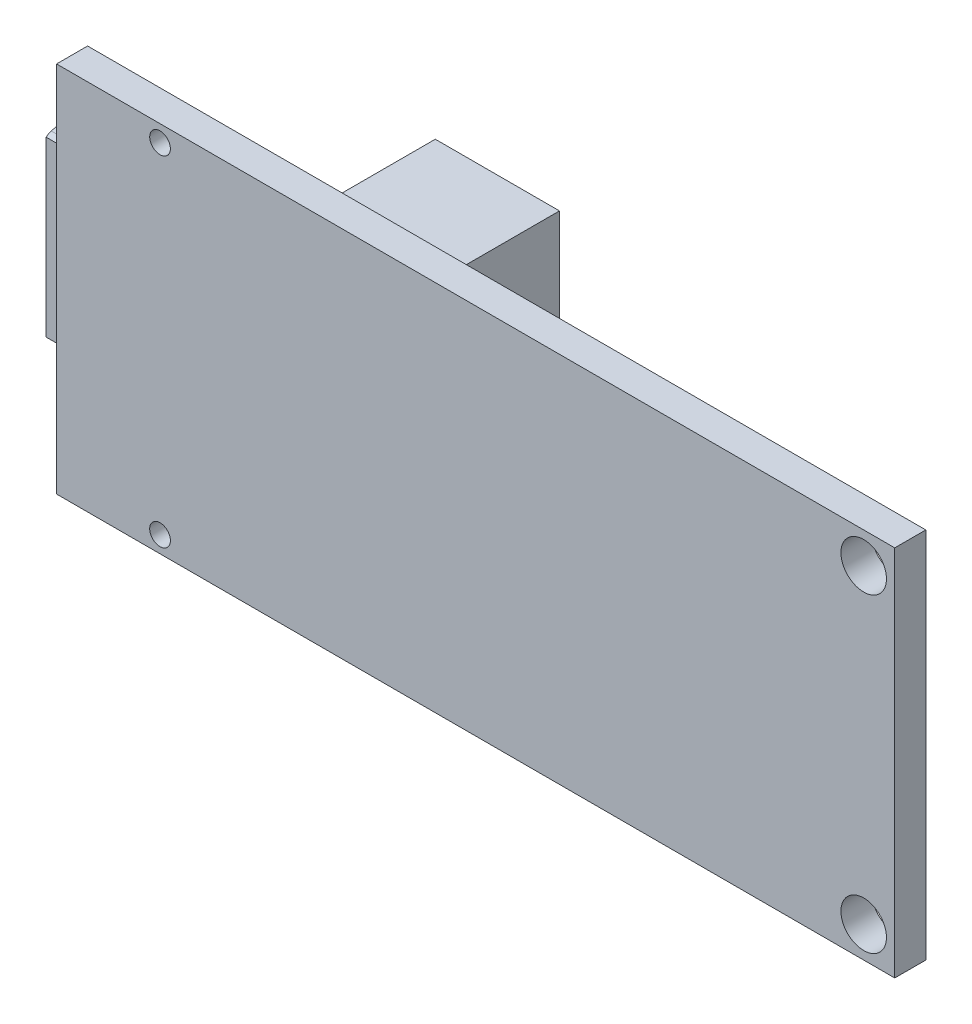
ISO-10303-21;
HEADER;
FILE_DESCRIPTION(('STEP AP214'),'2;1');
FILE_NAME('part.step','',(''),(''),'','','');
FILE_SCHEMA(('AUTOMOTIVE_DESIGN { 1 0 10303 214 1 1 1 1 }'));
ENDSEC;
DATA;
#1=APPLICATION_CONTEXT('core data for automotive mechanical design processes');
#2=APPLICATION_PROTOCOL_DEFINITION('international standard','automotive_design',2000,#1);
#3=PRODUCT_CONTEXT('',#1,'mechanical');
#4=PRODUCT('Part','Part','',(#3));
#5=PRODUCT_RELATED_PRODUCT_CATEGORY('part','',(#4));
#6=PRODUCT_DEFINITION_FORMATION('','',#4);
#7=PRODUCT_DEFINITION_CONTEXT('part definition',#1,'design');
#8=PRODUCT_DEFINITION('design','',#6,#7);
#9=PRODUCT_DEFINITION_SHAPE('','',#8);
#10=(LENGTH_UNIT() NAMED_UNIT(*) SI_UNIT(.MILLI.,.METRE.));
#11=(NAMED_UNIT(*) PLANE_ANGLE_UNIT() SI_UNIT($,.RADIAN.));
#12=(NAMED_UNIT(*) SI_UNIT($,.STERADIAN.) SOLID_ANGLE_UNIT());
#13=UNCERTAINTY_MEASURE_WITH_UNIT(LENGTH_MEASURE(1.E-05),#10,'distance_accuracy_value','');
#14=(GEOMETRIC_REPRESENTATION_CONTEXT(3) GLOBAL_UNCERTAINTY_ASSIGNED_CONTEXT((#13)) GLOBAL_UNIT_ASSIGNED_CONTEXT((#10,
#11,#12)) REPRESENTATION_CONTEXT('',''));
#15=CARTESIAN_POINT('',(0.,0.,0.));
#16=DIRECTION('',(0.,0.,1.));
#17=DIRECTION('',(1.,0.,0.));
#18=AXIS2_PLACEMENT_3D('',#15,#16,#17);
#19=CARTESIAN_POINT('',(0.,0.,0.));
#20=DIRECTION('',(0.,0.,-1.));
#21=DIRECTION('',(-1.,0.,0.));
#22=AXIS2_PLACEMENT_3D('',#19,#20,#21);
#23=PLANE('',#22);
#24=CARTESIAN_POINT('',(-15.25,8.2,0.));
#25=DIRECTION('',(0.,0.,-1.));
#26=DIRECTION('',(-1.,0.,0.));
#27=AXIS2_PLACEMENT_3D('',#24,#25,#26);
#28=CIRCLE('',#27,0.499999999999999);
#29=CARTESIAN_POINT('',(-15.75,8.2,0.));
#30=VERTEX_POINT('',#29);
#31=EDGE_CURVE('E291',#30,#30,#28,.T.);
#32=ORIENTED_EDGE('',*,*,#31,.F.);
#33=EDGE_LOOP('',(#32));
#34=FACE_BOUND('',#33,.T.);
#35=CARTESIAN_POINT('',(-15.25,-8.2,0.));
#36=DIRECTION('',(0.,0.,-1.));
#37=DIRECTION('',(1.,0.,0.));
#38=AXIS2_PLACEMENT_3D('',#35,#36,#37);
#39=CIRCLE('',#38,0.499999999999999);
#40=CARTESIAN_POINT('',(-14.75,-8.2,0.));
#41=VERTEX_POINT('',#40);
#42=EDGE_CURVE('E290',#41,#41,#39,.T.);
#43=ORIENTED_EDGE('',*,*,#42,.F.);
#44=EDGE_LOOP('',(#43));
#45=FACE_BOUND('',#44,.T.);
#46=CARTESIAN_POINT('',(18.75,7.5,0.));
#47=DIRECTION('',(0.,0.,-1.));
#48=DIRECTION('',(-1.,0.,0.));
#49=AXIS2_PLACEMENT_3D('',#46,#47,#48);
#50=CIRCLE('',#49,1.1);
#51=CARTESIAN_POINT('',(17.65,7.5,0.));
#52=VERTEX_POINT('',#51);
#53=EDGE_CURVE('E431',#52,#52,#50,.T.);
#54=ORIENTED_EDGE('',*,*,#53,.F.);
#55=EDGE_LOOP('',(#54));
#56=FACE_BOUND('',#55,.T.);
#57=CARTESIAN_POINT('',(18.75,-7.5,0.));
#58=DIRECTION('',(0.,0.,-1.));
#59=DIRECTION('',(1.,0.,0.));
#60=AXIS2_PLACEMENT_3D('',#57,#58,#59);
#61=CIRCLE('',#60,1.1);
#62=CARTESIAN_POINT('',(19.85,-7.5,0.));
#63=VERTEX_POINT('',#62);
#64=EDGE_CURVE('E435',#63,#63,#61,.T.);
#65=ORIENTED_EDGE('',*,*,#64,.F.);
#66=EDGE_LOOP('',(#65));
#67=FACE_BOUND('',#66,.T.);
#68=DIRECTION('',(1.,0.,0.));
#69=VECTOR('',#68,1.);
#70=CARTESIAN_POINT('',(-2.25000000000001,8.7,0.));
#71=LINE('',#70,#69);
#72=CARTESIAN_POINT('',(-8.25000000000001,8.7,0.));
#73=VERTEX_POINT('',#72);
#74=CARTESIAN_POINT('',(-2.25000000000001,8.7,0.));
#75=VERTEX_POINT('',#74);
#76=EDGE_CURVE('E405',#73,#75,#71,.T.);
#77=ORIENTED_EDGE('',*,*,#76,.F.);
#78=DIRECTION('',(0.,1.,0.));
#79=VECTOR('',#78,1.);
#80=CARTESIAN_POINT('',(-8.25000000000001,8.7,0.));
#81=LINE('',#80,#79);
#82=CARTESIAN_POINT('',(-8.25000000000001,2.7,0.));
#83=VERTEX_POINT('',#82);
#84=EDGE_CURVE('E383',#83,#73,#81,.T.);
#85=ORIENTED_EDGE('',*,*,#84,.F.);
#86=DIRECTION('',(-1.,0.,0.));
#87=VECTOR('',#86,1.);
#88=CARTESIAN_POINT('',(-2.25000000000001,2.7,0.));
#89=LINE('',#88,#87);
#90=CARTESIAN_POINT('',(-2.25000000000001,2.7,0.));
#91=VERTEX_POINT('',#90);
#92=EDGE_CURVE('E392',#91,#83,#89,.T.);
#93=ORIENTED_EDGE('',*,*,#92,.F.);
#94=DIRECTION('',(0.,-1.,0.));
#95=VECTOR('',#94,1.);
#96=CARTESIAN_POINT('',(-2.25000000000001,8.7,0.));
#97=LINE('',#96,#95);
#98=EDGE_CURVE('E408',#75,#91,#97,.T.);
#99=ORIENTED_EDGE('',*,*,#98,.F.);
#100=EDGE_LOOP('',(#77,#85,#93,#99));
#101=FACE_BOUND('',#100,.T.);
#102=DIRECTION('',(0.,-1.,0.));
#103=VECTOR('',#102,1.);
#104=CARTESIAN_POINT('',(-20.25,-9.,0.));
#105=LINE('',#104,#103);
#106=CARTESIAN_POINT('',(-20.25,-4.18410728804132,0.));
#107=VERTEX_POINT('',#106);
#108=CARTESIAN_POINT('',(-20.25,-9.,0.));
#109=VERTEX_POINT('',#108);
#110=EDGE_CURVE('E463',#107,#109,#105,.T.);
#111=ORIENTED_EDGE('',*,*,#110,.F.);
#112=DIRECTION('',(-1.,0.,0.));
#113=VECTOR('',#112,1.);
#114=CARTESIAN_POINT('',(-12.25,-4.18410728804132,0.));
#115=LINE('',#114,#113);
#116=CARTESIAN_POINT('',(-12.25,-4.18410728804132,0.));
#117=VERTEX_POINT('',#116);
#118=EDGE_CURVE('E219',#117,#107,#115,.T.);
#119=ORIENTED_EDGE('',*,*,#118,.F.);
#120=DIRECTION('',(0.,-1.,0.));
#121=VECTOR('',#120,1.);
#122=CARTESIAN_POINT('',(-12.25,-4.5,0.));
#123=LINE('',#122,#121);
#124=CARTESIAN_POINT('',(-12.25,4.18410728804132,0.));
#125=VERTEX_POINT('',#124);
#126=EDGE_CURVE('E367',#125,#117,#123,.T.);
#127=ORIENTED_EDGE('',*,*,#126,.F.);
#128=DIRECTION('',(-1.,0.,0.));
#129=VECTOR('',#128,1.);
#130=CARTESIAN_POINT('',(-12.25,4.18410728804132,0.));
#131=LINE('',#130,#129);
#132=CARTESIAN_POINT('',(-20.25,4.18410728804132,0.));
#133=VERTEX_POINT('',#132);
#134=EDGE_CURVE('E344',#125,#133,#131,.T.);
#135=ORIENTED_EDGE('',*,*,#134,.T.);
#136=CARTESIAN_POINT('',(-20.25,9.,0.));
#137=VERTEX_POINT('',#136);
#138=EDGE_CURVE('E464',#137,#133,#105,.T.);
#139=ORIENTED_EDGE('',*,*,#138,.F.);
#140=DIRECTION('',(-1.,0.,0.));
#141=VECTOR('',#140,1.);
#142=CARTESIAN_POINT('',(-20.25,9.,0.));
#143=LINE('',#142,#141);
#144=CARTESIAN_POINT('',(20.25,9.,0.));
#145=VERTEX_POINT('',#144);
#146=EDGE_CURVE('E460',#145,#137,#143,.T.);
#147=ORIENTED_EDGE('',*,*,#146,.F.);
#148=DIRECTION('',(0.,1.,0.));
#149=VECTOR('',#148,1.);
#150=CARTESIAN_POINT('',(20.25,-9.,0.));
#151=LINE('',#150,#149);
#152=CARTESIAN_POINT('',(20.25,-9.,0.));
#153=VERTEX_POINT('',#152);
#154=EDGE_CURVE('E430',#153,#145,#151,.T.);
#155=ORIENTED_EDGE('',*,*,#154,.F.);
#156=DIRECTION('',(1.,0.,0.));
#157=VECTOR('',#156,1.);
#158=CARTESIAN_POINT('',(-20.25,-9.,0.));
#159=LINE('',#158,#157);
#160=EDGE_CURVE('E447',#109,#153,#159,.T.);
#161=ORIENTED_EDGE('',*,*,#160,.F.);
#162=EDGE_LOOP('',(#111,#119,#127,#135,#139,#147,#155,#161));
#163=FACE_BOUND('',#162,.T.);
#164=ADVANCED_FACE('F49',(#34,#45,#56,#67,#101,#163),#23,.T.);
#165=CARTESIAN_POINT('',(-12.25,-4.5,-3.));
#166=DIRECTION('',(-1.,0.,0.));
#167=DIRECTION('',(0.,0.,1.));
#168=AXIS2_PLACEMENT_3D('',#165,#166,#167);
#169=PLANE('',#168);
#170=CARTESIAN_POINT('',(-12.25,-3.84235950746112,-0.36497733418461));
#171=DIRECTION('',(-1.,0.,0.));
#172=DIRECTION('',(0.,0.,1.));
#173=AXIS2_PLACEMENT_3D('',#170,#171,#172);
#174=CIRCLE('',#173,0.5);
#175=CARTESIAN_POINT('',(-12.25,-4.32632827093174,-0.239381808847451));
#176=VERTEX_POINT('',#175);
#177=EDGE_CURVE('E220',#176,#117,#174,.T.);
#178=ORIENTED_EDGE('',*,*,#177,.F.);
#179=CARTESIAN_POINT('',(-12.25,0.916666666666665,-1.6));
#180=DIRECTION('',(-1.,0.,0.));
#181=DIRECTION('',(0.,0.,1.));
#182=AXIS2_PLACEMENT_3D('',#179,#180,#181);
#183=CIRCLE('',#182,5.41666666666667);
#184=CARTESIAN_POINT('',(-12.25,-4.32632827093174,-2.96061819115255));
#185=VERTEX_POINT('',#184);
#186=EDGE_CURVE('E215',#176,#185,#183,.F.);
#187=ORIENTED_EDGE('',*,*,#186,.T.);
#188=CARTESIAN_POINT('',(-12.25,-3.84235950746112,-2.83502266581539));
#189=DIRECTION('',(-1.,0.,0.));
#190=DIRECTION('',(0.,0.,1.));
#191=AXIS2_PLACEMENT_3D('',#188,#189,#190);
#192=CIRCLE('',#191,0.5);
#193=CARTESIAN_POINT('',(-12.25,-4.31435789644708,-3.));
#194=VERTEX_POINT('',#193);
#195=EDGE_CURVE('E358',#185,#194,#192,.F.);
#196=ORIENTED_EDGE('',*,*,#195,.T.);
#197=DIRECTION('',(0.,-1.,0.));
#198=VECTOR('',#197,1.);
#199=CARTESIAN_POINT('',(-12.25,-4.5,-3.));
#200=LINE('',#199,#198);
#201=CARTESIAN_POINT('',(-12.25,4.31435789644708,-3.));
#202=VERTEX_POINT('',#201);
#203=EDGE_CURVE('E379',#202,#194,#200,.T.);
#204=ORIENTED_EDGE('',*,*,#203,.F.);
#205=CARTESIAN_POINT('',(-12.25,3.84235950746112,-2.83502266581539));
#206=DIRECTION('',(-1.,0.,0.));
#207=DIRECTION('',(0.,0.,1.));
#208=AXIS2_PLACEMENT_3D('',#205,#206,#207);
#209=CIRCLE('',#208,0.500000000000001);
#210=CARTESIAN_POINT('',(-12.25,4.32632827093174,-2.96061819115255));
#211=VERTEX_POINT('',#210);
#212=EDGE_CURVE('E67',#211,#202,#209,.T.);
#213=ORIENTED_EDGE('',*,*,#212,.F.);
#214=CARTESIAN_POINT('',(-12.25,-0.916666666666665,-1.6));
#215=DIRECTION('',(-1.,0.,0.));
#216=DIRECTION('',(0.,0.,1.));
#217=AXIS2_PLACEMENT_3D('',#214,#215,#216);
#218=CIRCLE('',#217,5.41666666666667);
#219=CARTESIAN_POINT('',(-12.25,4.32632827093174,-0.239381808847453));
#220=VERTEX_POINT('',#219);
#221=EDGE_CURVE('E346',#220,#211,#218,.T.);
#222=ORIENTED_EDGE('',*,*,#221,.F.);
#223=CARTESIAN_POINT('',(-12.25,3.84235950746112,-0.364977334184611));
#224=DIRECTION('',(-1.,0.,0.));
#225=DIRECTION('',(0.,0.,1.));
#226=AXIS2_PLACEMENT_3D('',#223,#224,#225);
#227=CIRCLE('',#226,0.5);
#228=EDGE_CURVE('E327',#220,#125,#227,.F.);
#229=ORIENTED_EDGE('',*,*,#228,.T.);
#230=ORIENTED_EDGE('',*,*,#126,.T.);
#231=EDGE_LOOP('',(#178,#187,#196,#204,#213,#222,#229,#230));
#232=FACE_BOUND('',#231,.T.);
#233=ADVANCED_FACE('F507',(#232),#169,.F.);
#234=CARTESIAN_POINT('',(0.,0.,-3.));
#235=DIRECTION('',(0.,0.,1.));
#236=DIRECTION('',(1.,0.,0.));
#237=AXIS2_PLACEMENT_3D('',#234,#235,#236);
#238=PLANE('',#237);
#239=ORIENTED_EDGE('',*,*,#203,.T.);
#240=DIRECTION('',(-1.,0.,0.));
#241=VECTOR('',#240,1.);
#242=CARTESIAN_POINT('',(-12.25,-4.31435789644708,-3.));
#243=LINE('',#242,#241);
#244=CARTESIAN_POINT('',(-22.25,-4.31435789644708,-3.));
#245=VERTEX_POINT('',#244);
#246=EDGE_CURVE('E364',#194,#245,#243,.T.);
#247=ORIENTED_EDGE('',*,*,#246,.T.);
#248=DIRECTION('',(0.,-1.,0.));
#249=VECTOR('',#248,1.);
#250=CARTESIAN_POINT('',(-22.25,0.,-3.));
#251=LINE('',#250,#249);
#252=CARTESIAN_POINT('',(-22.25,4.31435789644708,-3.));
#253=VERTEX_POINT('',#252);
#254=EDGE_CURVE('E255',#253,#245,#251,.T.);
#255=ORIENTED_EDGE('',*,*,#254,.F.);
#256=DIRECTION('',(-1.,0.,0.));
#257=VECTOR('',#256,1.);
#258=CARTESIAN_POINT('',(-12.25,4.31435789644708,-3.));
#259=LINE('',#258,#257);
#260=EDGE_CURVE('E374',#202,#253,#259,.T.);
#261=ORIENTED_EDGE('',*,*,#260,.F.);
#262=EDGE_LOOP('',(#239,#247,#255,#261));
#263=FACE_BOUND('',#262,.T.);
#264=ADVANCED_FACE('F514',(#263),#238,.F.);
#265=CARTESIAN_POINT('',(20.25,-9.,1.5));
#266=DIRECTION('',(-1.,0.,0.));
#267=DIRECTION('',(0.,0.,1.));
#268=AXIS2_PLACEMENT_3D('',#265,#266,#267);
#269=PLANE('',#268);
#270=ORIENTED_EDGE('',*,*,#154,.T.);
#271=DIRECTION('',(0.,0.,-1.));
#272=VECTOR('',#271,1.);
#273=CARTESIAN_POINT('',(20.25,9.,1.5));
#274=LINE('',#273,#272);
#275=CARTESIAN_POINT('',(20.25,9.,1.5));
#276=VERTEX_POINT('',#275);
#277=EDGE_CURVE('E11',#276,#145,#274,.T.);
#278=ORIENTED_EDGE('',*,*,#277,.F.);
#279=DIRECTION('',(0.,1.,0.));
#280=VECTOR('',#279,1.);
#281=CARTESIAN_POINT('',(20.25,-9.,1.5));
#282=LINE('',#281,#280);
#283=CARTESIAN_POINT('',(20.25,-9.,1.5));
#284=VERTEX_POINT('',#283);
#285=EDGE_CURVE('E442',#284,#276,#282,.T.);
#286=ORIENTED_EDGE('',*,*,#285,.F.);
#287=DIRECTION('',(0.,0.,-1.));
#288=VECTOR('',#287,1.);
#289=CARTESIAN_POINT('',(20.25,-9.,1.5));
#290=LINE('',#289,#288);
#291=EDGE_CURVE('E456',#284,#153,#290,.T.);
#292=ORIENTED_EDGE('',*,*,#291,.T.);
#293=EDGE_LOOP('',(#270,#278,#286,#292));
#294=FACE_BOUND('',#293,.T.);
#295=ADVANCED_FACE('F51',(#294),#269,.F.);
#296=CARTESIAN_POINT('',(-20.25,9.,1.5));
#297=DIRECTION('',(0.,-1.,0.));
#298=DIRECTION('',(0.,0.,-1.));
#299=AXIS2_PLACEMENT_3D('',#296,#297,#298);
#300=PLANE('',#299);
#301=ORIENTED_EDGE('',*,*,#146,.T.);
#302=DIRECTION('',(0.,0.,-1.));
#303=VECTOR('',#302,1.);
#304=CARTESIAN_POINT('',(-20.25,9.,1.5));
#305=LINE('',#304,#303);
#306=CARTESIAN_POINT('',(-20.25,9.,1.5));
#307=VERTEX_POINT('',#306);
#308=EDGE_CURVE('E59',#307,#137,#305,.T.);
#309=ORIENTED_EDGE('',*,*,#308,.F.);
#310=DIRECTION('',(-1.,0.,0.));
#311=VECTOR('',#310,1.);
#312=CARTESIAN_POINT('',(-20.25,9.,1.5));
#313=LINE('',#312,#311);
#314=EDGE_CURVE('E446',#276,#307,#313,.T.);
#315=ORIENTED_EDGE('',*,*,#314,.F.);
#316=ORIENTED_EDGE('',*,*,#277,.T.);
#317=EDGE_LOOP('',(#301,#309,#315,#316));
#318=FACE_BOUND('',#317,.T.);
#319=ADVANCED_FACE('F528',(#318),#300,.F.);
#320=CARTESIAN_POINT('',(-20.25,-9.,1.5));
#321=DIRECTION('',(1.,0.,0.));
#322=DIRECTION('',(0.,0.,-1.));
#323=AXIS2_PLACEMENT_3D('',#320,#321,#322);
#324=PLANE('',#323);
#325=ORIENTED_EDGE('',*,*,#138,.T.);
#326=EDGE_CURVE('E468',#133,#107,#105,.T.);
#327=ORIENTED_EDGE('',*,*,#326,.T.);
#328=ORIENTED_EDGE('',*,*,#110,.T.);
#329=DIRECTION('',(0.,0.,-1.));
#330=VECTOR('',#329,1.);
#331=CARTESIAN_POINT('',(-20.25,-9.,1.5));
#332=LINE('',#331,#330);
#333=CARTESIAN_POINT('',(-20.25,-9.,1.5));
#334=VERTEX_POINT('',#333);
#335=EDGE_CURVE('E474',#334,#109,#332,.T.);
#336=ORIENTED_EDGE('',*,*,#335,.F.);
#337=DIRECTION('',(0.,-1.,0.));
#338=VECTOR('',#337,1.);
#339=CARTESIAN_POINT('',(-20.25,-9.,1.5));
#340=LINE('',#339,#338);
#341=EDGE_CURVE('E450',#307,#334,#340,.T.);
#342=ORIENTED_EDGE('',*,*,#341,.F.);
#343=ORIENTED_EDGE('',*,*,#308,.T.);
#344=EDGE_LOOP('',(#325,#327,#328,#336,#342,#343));
#345=FACE_BOUND('',#344,.T.);
#346=ADVANCED_FACE('F525',(#345),#324,.F.);
#347=CARTESIAN_POINT('',(-20.25,-9.,1.5));
#348=DIRECTION('',(0.,1.,0.));
#349=DIRECTION('',(0.,0.,1.));
#350=AXIS2_PLACEMENT_3D('',#347,#348,#349);
#351=PLANE('',#350);
#352=ORIENTED_EDGE('',*,*,#160,.T.);
#353=ORIENTED_EDGE('',*,*,#291,.F.);
#354=DIRECTION('',(1.,0.,0.));
#355=VECTOR('',#354,1.);
#356=CARTESIAN_POINT('',(-20.25,-9.,1.5));
#357=LINE('',#356,#355);
#358=EDGE_CURVE('E453',#334,#284,#357,.T.);
#359=ORIENTED_EDGE('',*,*,#358,.F.);
#360=ORIENTED_EDGE('',*,*,#335,.T.);
#361=EDGE_LOOP('',(#352,#353,#359,#360));
#362=FACE_BOUND('',#361,.T.);
#363=ADVANCED_FACE('F522',(#362),#351,.F.);
#364=CARTESIAN_POINT('',(0.,0.,1.5));
#365=DIRECTION('',(0.,0.,-1.));
#366=DIRECTION('',(-1.,0.,0.));
#367=AXIS2_PLACEMENT_3D('',#364,#365,#366);
#368=PLANE('',#367);
#369=CARTESIAN_POINT('',(-15.25,8.2,1.5));
#370=DIRECTION('',(0.,0.,-1.));
#371=DIRECTION('',(-1.,0.,0.));
#372=AXIS2_PLACEMENT_3D('',#369,#370,#371);
#373=CIRCLE('',#372,0.499999999999999);
#374=CARTESIAN_POINT('',(-15.75,8.2,1.5));
#375=VERTEX_POINT('',#374);
#376=EDGE_CURVE('E53',#375,#375,#373,.T.);
#377=ORIENTED_EDGE('',*,*,#376,.T.);
#378=EDGE_LOOP('',(#377));
#379=FACE_BOUND('',#378,.T.);
#380=CARTESIAN_POINT('',(-15.25,-8.2,1.5));
#381=DIRECTION('',(0.,0.,-1.));
#382=DIRECTION('',(-1.,0.,0.));
#383=AXIS2_PLACEMENT_3D('',#380,#381,#382);
#384=CIRCLE('',#383,0.499999999999999);
#385=CARTESIAN_POINT('',(-15.75,-8.2,1.5));
#386=VERTEX_POINT('',#385);
#387=EDGE_CURVE('E295',#386,#386,#384,.T.);
#388=ORIENTED_EDGE('',*,*,#387,.T.);
#389=EDGE_LOOP('',(#388));
#390=FACE_BOUND('',#389,.T.);
#391=CARTESIAN_POINT('',(18.75,7.5,1.5));
#392=DIRECTION('',(0.,0.,-1.));
#393=DIRECTION('',(-1.,0.,0.));
#394=AXIS2_PLACEMENT_3D('',#391,#392,#393);
#395=CIRCLE('',#394,1.1);
#396=CARTESIAN_POINT('',(17.65,7.5,1.5));
#397=VERTEX_POINT('',#396);
#398=EDGE_CURVE('E426',#397,#397,#395,.T.);
#399=ORIENTED_EDGE('',*,*,#398,.T.);
#400=EDGE_LOOP('',(#399));
#401=FACE_BOUND('',#400,.T.);
#402=CARTESIAN_POINT('',(18.75,-7.5,1.5));
#403=DIRECTION('',(0.,0.,-1.));
#404=DIRECTION('',(1.,0.,0.));
#405=AXIS2_PLACEMENT_3D('',#402,#403,#404);
#406=CIRCLE('',#405,1.1);
#407=CARTESIAN_POINT('',(19.85,-7.5,1.5));
#408=VERTEX_POINT('',#407);
#409=EDGE_CURVE('E425',#408,#408,#406,.T.);
#410=ORIENTED_EDGE('',*,*,#409,.T.);
#411=EDGE_LOOP('',(#410));
#412=FACE_BOUND('',#411,.T.);
#413=ORIENTED_EDGE('',*,*,#285,.T.);
#414=ORIENTED_EDGE('',*,*,#314,.T.);
#415=ORIENTED_EDGE('',*,*,#341,.T.);
#416=ORIENTED_EDGE('',*,*,#358,.T.);
#417=EDGE_LOOP('',(#413,#414,#415,#416));
#418=FACE_BOUND('',#417,.T.);
#419=ADVANCED_FACE('F488',(#379,#390,#401,#412,#418),#368,.F.);
#420=CARTESIAN_POINT('',(18.75,-7.5,1.5));
#421=DIRECTION('',(0.,0.,-1.));
#422=DIRECTION('',(-1.,0.,0.));
#423=AXIS2_PLACEMENT_3D('',#420,#421,#422);
#424=CYLINDRICAL_SURFACE('',#423,1.1);
#425=ORIENTED_EDGE('',*,*,#409,.F.);
#426=EDGE_LOOP('',(#425));
#427=FACE_BOUND('',#426,.T.);
#428=ORIENTED_EDGE('',*,*,#64,.T.);
#429=EDGE_LOOP('',(#428));
#430=FACE_BOUND('',#429,.T.);
#431=ADVANCED_FACE('F573',(#427,#430),#424,.F.);
#432=CARTESIAN_POINT('',(18.75,7.5,1.5));
#433=DIRECTION('',(0.,0.,-1.));
#434=DIRECTION('',(-1.,0.,0.));
#435=AXIS2_PLACEMENT_3D('',#432,#433,#434);
#436=CYLINDRICAL_SURFACE('',#435,1.1);
#437=ORIENTED_EDGE('',*,*,#398,.F.);
#438=EDGE_LOOP('',(#437));
#439=FACE_BOUND('',#438,.T.);
#440=ORIENTED_EDGE('',*,*,#53,.T.);
#441=EDGE_LOOP('',(#440));
#442=FACE_BOUND('',#441,.T.);
#443=ADVANCED_FACE('F577',(#439,#442),#436,.F.);
#444=CARTESIAN_POINT('',(-8.25000000000001,8.7,-4.8));
#445=DIRECTION('',(1.,0.,0.));
#446=DIRECTION('',(0.,0.,-1.));
#447=AXIS2_PLACEMENT_3D('',#444,#445,#446);
#448=PLANE('',#447);
#449=ORIENTED_EDGE('',*,*,#84,.T.);
#450=DIRECTION('',(0.,0.,1.));
#451=VECTOR('',#450,1.);
#452=CARTESIAN_POINT('',(-8.25000000000001,8.7,-4.8));
#453=LINE('',#452,#451);
#454=CARTESIAN_POINT('',(-8.25000000000001,8.7,-4.8));
#455=VERTEX_POINT('',#454);
#456=EDGE_CURVE('E422',#455,#73,#453,.T.);
#457=ORIENTED_EDGE('',*,*,#456,.F.);
#458=DIRECTION('',(0.,1.,0.));
#459=VECTOR('',#458,1.);
#460=CARTESIAN_POINT('',(-8.25000000000001,8.7,-4.8));
#461=LINE('',#460,#459);
#462=CARTESIAN_POINT('',(-8.25000000000001,2.7,-4.8));
#463=VERTEX_POINT('',#462);
#464=EDGE_CURVE('E387',#463,#455,#461,.T.);
#465=ORIENTED_EDGE('',*,*,#464,.F.);
#466=DIRECTION('',(0.,0.,1.));
#467=VECTOR('',#466,1.);
#468=CARTESIAN_POINT('',(-8.25000000000001,2.7,-4.8));
#469=LINE('',#468,#467);
#470=EDGE_CURVE('E401',#463,#83,#469,.T.);
#471=ORIENTED_EDGE('',*,*,#470,.T.);
#472=EDGE_LOOP('',(#449,#457,#465,#471));
#473=FACE_BOUND('',#472,.T.);
#474=ADVANCED_FACE('F582',(#473),#448,.F.);
#475=CARTESIAN_POINT('',(-2.25000000000001,8.7,-4.8));
#476=DIRECTION('',(0.,-1.,0.));
#477=DIRECTION('',(0.,0.,-1.));
#478=AXIS2_PLACEMENT_3D('',#475,#476,#477);
#479=PLANE('',#478);
#480=ORIENTED_EDGE('',*,*,#76,.T.);
#481=DIRECTION('',(0.,0.,1.));
#482=VECTOR('',#481,1.);
#483=CARTESIAN_POINT('',(-2.25000000000001,8.7,-4.8));
#484=LINE('',#483,#482);
#485=CARTESIAN_POINT('',(-2.25000000000001,8.7,-4.8));
#486=VERTEX_POINT('',#485);
#487=EDGE_CURVE('E418',#486,#75,#484,.T.);
#488=ORIENTED_EDGE('',*,*,#487,.F.);
#489=DIRECTION('',(1.,0.,0.));
#490=VECTOR('',#489,1.);
#491=CARTESIAN_POINT('',(-2.25000000000001,8.7,-4.8));
#492=LINE('',#491,#490);
#493=EDGE_CURVE('E391',#455,#486,#492,.T.);
#494=ORIENTED_EDGE('',*,*,#493,.F.);
#495=ORIENTED_EDGE('',*,*,#456,.T.);
#496=EDGE_LOOP('',(#480,#488,#494,#495));
#497=FACE_BOUND('',#496,.T.);
#498=ADVANCED_FACE('F590',(#497),#479,.F.);
#499=CARTESIAN_POINT('',(-2.25000000000001,8.7,-4.8));
#500=DIRECTION('',(-1.,0.,0.));
#501=DIRECTION('',(0.,-1.,0.));
#502=AXIS2_PLACEMENT_3D('',#499,#500,#501);
#503=PLANE('',#502);
#504=ORIENTED_EDGE('',*,*,#98,.T.);
#505=DIRECTION('',(0.,0.,1.));
#506=VECTOR('',#505,1.);
#507=CARTESIAN_POINT('',(-2.25000000000001,2.7,-4.8));
#508=LINE('',#507,#506);
#509=CARTESIAN_POINT('',(-2.25000000000001,2.7,-4.8));
#510=VERTEX_POINT('',#509);
#511=EDGE_CURVE('E75',#510,#91,#508,.T.);
#512=ORIENTED_EDGE('',*,*,#511,.F.);
#513=DIRECTION('',(0.,-1.,0.));
#514=VECTOR('',#513,1.);
#515=CARTESIAN_POINT('',(-2.25000000000001,8.7,-4.8));
#516=LINE('',#515,#514);
#517=EDGE_CURVE('E395',#486,#510,#516,.T.);
#518=ORIENTED_EDGE('',*,*,#517,.F.);
#519=ORIENTED_EDGE('',*,*,#487,.T.);
#520=EDGE_LOOP('',(#504,#512,#518,#519));
#521=FACE_BOUND('',#520,.T.);
#522=ADVANCED_FACE('F594',(#521),#503,.F.);
#523=CARTESIAN_POINT('',(-2.25000000000001,2.7,-4.8));
#524=DIRECTION('',(0.,1.,0.));
#525=DIRECTION('',(-1.,0.,0.));
#526=AXIS2_PLACEMENT_3D('',#523,#524,#525);
#527=PLANE('',#526);
#528=ORIENTED_EDGE('',*,*,#92,.T.);
#529=ORIENTED_EDGE('',*,*,#470,.F.);
#530=DIRECTION('',(-1.,0.,0.));
#531=VECTOR('',#530,1.);
#532=CARTESIAN_POINT('',(-2.25000000000001,2.7,-4.8));
#533=LINE('',#532,#531);
#534=EDGE_CURVE('E398',#510,#463,#533,.T.);
#535=ORIENTED_EDGE('',*,*,#534,.F.);
#536=ORIENTED_EDGE('',*,*,#511,.T.);
#537=EDGE_LOOP('',(#528,#529,#535,#536));
#538=FACE_BOUND('',#537,.T.);
#539=ADVANCED_FACE('F598',(#538),#527,.F.);
#540=CARTESIAN_POINT('',(0.,0.,-4.8));
#541=DIRECTION('',(0.,0.,-1.));
#542=DIRECTION('',(-1.,0.,0.));
#543=AXIS2_PLACEMENT_3D('',#540,#541,#542);
#544=PLANE('',#543);
#545=ORIENTED_EDGE('',*,*,#464,.T.);
#546=ORIENTED_EDGE('',*,*,#493,.T.);
#547=ORIENTED_EDGE('',*,*,#517,.T.);
#548=ORIENTED_EDGE('',*,*,#534,.T.);
#549=EDGE_LOOP('',(#545,#546,#547,#548));
#550=FACE_BOUND('',#549,.T.);
#551=ADVANCED_FACE('F602',(#550),#544,.T.);
#552=CARTESIAN_POINT('',(-12.25,-0.916666666666665,-1.6));
#553=DIRECTION('',(-1.,0.,0.));
#554=DIRECTION('',(0.,0.,1.));
#555=AXIS2_PLACEMENT_3D('',#552,#553,#554);
#556=CYLINDRICAL_SURFACE('',#555,5.41666666666667);
#557=DIRECTION('',(-1.,0.,0.));
#558=VECTOR('',#557,1.);
#559=CARTESIAN_POINT('',(-12.25,4.32632827093174,-2.96061819115255));
#560=LINE('',#559,#558);
#561=CARTESIAN_POINT('',(-22.25,4.32632827093174,-2.96061819115255));
#562=VERTEX_POINT('',#561);
#563=EDGE_CURVE('E359',#211,#562,#560,.T.);
#564=ORIENTED_EDGE('',*,*,#563,.T.);
#565=CARTESIAN_POINT('',(-22.25,-0.916666666666665,-1.6));
#566=DIRECTION('',(-1.,0.,0.));
#567=DIRECTION('',(0.,0.,1.));
#568=AXIS2_PLACEMENT_3D('',#565,#566,#567);
#569=CIRCLE('',#568,5.41666666666667);
#570=CARTESIAN_POINT('',(-22.25,4.32632827093174,-0.239381808847453));
#571=VERTEX_POINT('',#570);
#572=EDGE_CURVE('E247',#571,#562,#569,.T.);
#573=ORIENTED_EDGE('',*,*,#572,.F.);
#574=DIRECTION('',(-1.,0.,0.));
#575=VECTOR('',#574,1.);
#576=CARTESIAN_POINT('',(-12.25,4.32632827093174,-0.239381808847453));
#577=LINE('',#576,#575);
#578=EDGE_CURVE('E351',#220,#571,#577,.T.);
#579=ORIENTED_EDGE('',*,*,#578,.F.);
#580=ORIENTED_EDGE('',*,*,#221,.T.);
#581=EDGE_LOOP('',(#564,#573,#579,#580));
#582=FACE_BOUND('',#581,.T.);
#583=ADVANCED_FACE('F558',(#582),#556,.T.);
#584=CARTESIAN_POINT('',(-12.25,3.84235950746112,-2.83502266581539));
#585=DIRECTION('',(-1.,0.,0.));
#586=DIRECTION('',(0.,0.,1.));
#587=AXIS2_PLACEMENT_3D('',#584,#585,#586);
#588=CYLINDRICAL_SURFACE('',#587,0.500000000000001);
#589=ORIENTED_EDGE('',*,*,#260,.T.);
#590=CARTESIAN_POINT('',(-22.25,3.84235950746112,-2.83502266581539));
#591=DIRECTION('',(-1.,0.,0.));
#592=DIRECTION('',(0.,0.,1.));
#593=AXIS2_PLACEMENT_3D('',#590,#591,#592);
#594=CIRCLE('',#593,0.500000000000001);
#595=EDGE_CURVE('E251',#562,#253,#594,.T.);
#596=ORIENTED_EDGE('',*,*,#595,.F.);
#597=ORIENTED_EDGE('',*,*,#563,.F.);
#598=ORIENTED_EDGE('',*,*,#212,.T.);
#599=EDGE_LOOP('',(#589,#596,#597,#598));
#600=FACE_BOUND('',#599,.T.);
#601=ADVANCED_FACE('F559',(#600),#588,.T.);
#602=CARTESIAN_POINT('',(-12.25,0.916666666666665,-1.6));
#603=DIRECTION('',(-1.,0.,0.));
#604=DIRECTION('',(0.,0.,1.));
#605=AXIS2_PLACEMENT_3D('',#602,#603,#604);
#606=CYLINDRICAL_SURFACE('',#605,5.41666666666667);
#607=DIRECTION('',(-1.,0.,0.));
#608=VECTOR('',#607,1.);
#609=CARTESIAN_POINT('',(-12.25,-4.32632827093174,-0.239381808847451));
#610=LINE('',#609,#608);
#611=CARTESIAN_POINT('',(-22.25,-4.32632827093174,-0.239381808847453));
#612=VERTEX_POINT('',#611);
#613=EDGE_CURVE('E209',#176,#612,#610,.T.);
#614=ORIENTED_EDGE('',*,*,#613,.T.);
#615=CARTESIAN_POINT('',(-22.25,0.916666666666665,-1.6));
#616=DIRECTION('',(-1.,0.,0.));
#617=DIRECTION('',(0.,0.,1.));
#618=AXIS2_PLACEMENT_3D('',#615,#616,#617);
#619=CIRCLE('',#618,5.41666666666667);
#620=CARTESIAN_POINT('',(-22.25,-4.32632827093174,-2.96061819115255));
#621=VERTEX_POINT('',#620);
#622=EDGE_CURVE('E213',#621,#612,#619,.T.);
#623=ORIENTED_EDGE('',*,*,#622,.F.);
#624=DIRECTION('',(-1.,0.,0.));
#625=VECTOR('',#624,1.);
#626=CARTESIAN_POINT('',(-12.25,-4.32632827093174,-2.96061819115255));
#627=LINE('',#626,#625);
#628=EDGE_CURVE('E363',#185,#621,#627,.T.);
#629=ORIENTED_EDGE('',*,*,#628,.F.);
#630=ORIENTED_EDGE('',*,*,#186,.F.);
#631=EDGE_LOOP('',(#614,#623,#629,#630));
#632=FACE_BOUND('',#631,.T.);
#633=ADVANCED_FACE('F211',(#632),#606,.T.);
#634=CARTESIAN_POINT('',(-12.25,-3.84235950746112,-2.83502266581539));
#635=DIRECTION('',(-1.,0.,0.));
#636=DIRECTION('',(0.,0.,1.));
#637=AXIS2_PLACEMENT_3D('',#634,#635,#636);
#638=CYLINDRICAL_SURFACE('',#637,0.5);
#639=ORIENTED_EDGE('',*,*,#628,.T.);
#640=CARTESIAN_POINT('',(-22.25,-3.84235950746112,-2.83502266581539));
#641=DIRECTION('',(-1.,0.,0.));
#642=DIRECTION('',(0.,0.,1.));
#643=AXIS2_PLACEMENT_3D('',#640,#641,#642);
#644=CIRCLE('',#643,0.5);
#645=EDGE_CURVE('E237',#245,#621,#644,.T.);
#646=ORIENTED_EDGE('',*,*,#645,.F.);
#647=ORIENTED_EDGE('',*,*,#246,.F.);
#648=ORIENTED_EDGE('',*,*,#195,.F.);
#649=EDGE_LOOP('',(#639,#646,#647,#648));
#650=FACE_BOUND('',#649,.T.);
#651=ADVANCED_FACE('F565',(#650),#638,.T.);
#652=CARTESIAN_POINT('',(-12.25,-3.84235950746112,-0.36497733418461));
#653=DIRECTION('',(-1.,0.,0.));
#654=DIRECTION('',(0.,0.,1.));
#655=AXIS2_PLACEMENT_3D('',#652,#653,#654);
#656=CYLINDRICAL_SURFACE('',#655,0.5);
#657=ORIENTED_EDGE('',*,*,#118,.T.);
#658=DIRECTION('',(1.,0.,0.));
#659=VECTOR('',#658,1.);
#660=CARTESIAN_POINT('',(-22.25,-4.18410728804132,0.));
#661=LINE('',#660,#659);
#662=CARTESIAN_POINT('',(-22.25,-4.18410728804132,0.));
#663=VERTEX_POINT('',#662);
#664=EDGE_CURVE('E226',#663,#107,#661,.T.);
#665=ORIENTED_EDGE('',*,*,#664,.F.);
#666=CARTESIAN_POINT('',(-22.25,-3.84235950746112,-0.36497733418461));
#667=DIRECTION('',(-1.,0.,0.));
#668=DIRECTION('',(0.,0.,1.));
#669=AXIS2_PLACEMENT_3D('',#666,#667,#668);
#670=CIRCLE('',#669,0.5);
#671=EDGE_CURVE('E223',#612,#663,#670,.T.);
#672=ORIENTED_EDGE('',*,*,#671,.F.);
#673=ORIENTED_EDGE('',*,*,#613,.F.);
#674=ORIENTED_EDGE('',*,*,#177,.T.);
#675=EDGE_LOOP('',(#657,#665,#672,#673,#674));
#676=FACE_BOUND('',#675,.T.);
#677=ADVANCED_FACE('F224',(#676),#656,.T.);
#678=CARTESIAN_POINT('',(-12.25,3.84235950746112,-0.364977334184611));
#679=DIRECTION('',(-1.,0.,0.));
#680=DIRECTION('',(0.,0.,1.));
#681=AXIS2_PLACEMENT_3D('',#678,#679,#680);
#682=CYLINDRICAL_SURFACE('',#681,0.5);
#683=ORIENTED_EDGE('',*,*,#578,.T.);
#684=CARTESIAN_POINT('',(-22.25,3.84235950746112,-0.364977334184611));
#685=DIRECTION('',(-1.,0.,0.));
#686=DIRECTION('',(0.,0.,1.));
#687=AXIS2_PLACEMENT_3D('',#684,#685,#686);
#688=CIRCLE('',#687,0.5);
#689=CARTESIAN_POINT('',(-22.25,4.18410728804132,0.));
#690=VERTEX_POINT('',#689);
#691=EDGE_CURVE('E243',#690,#571,#688,.T.);
#692=ORIENTED_EDGE('',*,*,#691,.F.);
#693=DIRECTION('',(1.,0.,0.));
#694=VECTOR('',#693,1.);
#695=CARTESIAN_POINT('',(-22.25,4.18410728804132,0.));
#696=LINE('',#695,#694);
#697=EDGE_CURVE('E284',#690,#133,#696,.T.);
#698=ORIENTED_EDGE('',*,*,#697,.T.);
#699=ORIENTED_EDGE('',*,*,#134,.F.);
#700=ORIENTED_EDGE('',*,*,#228,.F.);
#701=EDGE_LOOP('',(#683,#692,#698,#699,#700));
#702=FACE_BOUND('',#701,.T.);
#703=ADVANCED_FACE('F503',(#702),#682,.T.);
#704=CARTESIAN_POINT('',(-15.25,-8.2,5.));
#705=DIRECTION('',(0.,0.,-1.));
#706=DIRECTION('',(-1.,0.,0.));
#707=AXIS2_PLACEMENT_3D('',#704,#705,#706);
#708=CYLINDRICAL_SURFACE('',#707,0.499999999999999);
#709=ORIENTED_EDGE('',*,*,#42,.T.);
#710=EDGE_LOOP('',(#709));
#711=FACE_BOUND('',#710,.T.);
#712=ORIENTED_EDGE('',*,*,#387,.F.);
#713=EDGE_LOOP('',(#712));
#714=FACE_BOUND('',#713,.T.);
#715=ADVANCED_FACE('F493',(#711,#714),#708,.F.);
#716=CARTESIAN_POINT('',(-15.25,8.2,5.));
#717=DIRECTION('',(0.,0.,-1.));
#718=DIRECTION('',(-1.,0.,0.));
#719=AXIS2_PLACEMENT_3D('',#716,#717,#718);
#720=CYLINDRICAL_SURFACE('',#719,0.499999999999999);
#721=ORIENTED_EDGE('',*,*,#31,.T.);
#722=EDGE_LOOP('',(#721));
#723=FACE_BOUND('',#722,.T.);
#724=ORIENTED_EDGE('',*,*,#376,.F.);
#725=EDGE_LOOP('',(#724));
#726=FACE_BOUND('',#725,.T.);
#727=ADVANCED_FACE('F490',(#723,#726),#720,.F.);
#728=CARTESIAN_POINT('',(-22.25,0.,0.));
#729=DIRECTION('',(0.,0.,-1.));
#730=DIRECTION('',(-1.,0.,0.));
#731=AXIS2_PLACEMENT_3D('',#728,#729,#730);
#732=PLANE('',#731);
#733=ORIENTED_EDGE('',*,*,#664,.T.);
#734=ORIENTED_EDGE('',*,*,#326,.F.);
#735=ORIENTED_EDGE('',*,*,#697,.F.);
#736=DIRECTION('',(0.,1.,0.));
#737=VECTOR('',#736,1.);
#738=CARTESIAN_POINT('',(-22.25,0.,0.));
#739=LINE('',#738,#737);
#740=EDGE_CURVE('E230',#663,#690,#739,.T.);
#741=ORIENTED_EDGE('',*,*,#740,.F.);
#742=EDGE_LOOP('',(#733,#734,#735,#741));
#743=FACE_BOUND('',#742,.T.);
#744=ADVANCED_FACE('F492',(#743),#732,.F.);
#745=CARTESIAN_POINT('',(-22.25,0.,0.));
#746=DIRECTION('',(-1.,0.,0.));
#747=DIRECTION('',(0.,0.,1.));
#748=AXIS2_PLACEMENT_3D('',#745,#746,#747);
#749=PLANE('',#748);
#750=ORIENTED_EDGE('',*,*,#622,.T.);
#751=ORIENTED_EDGE('',*,*,#671,.T.);
#752=ORIENTED_EDGE('',*,*,#740,.T.);
#753=ORIENTED_EDGE('',*,*,#691,.T.);
#754=ORIENTED_EDGE('',*,*,#572,.T.);
#755=ORIENTED_EDGE('',*,*,#595,.T.);
#756=ORIENTED_EDGE('',*,*,#254,.T.);
#757=ORIENTED_EDGE('',*,*,#645,.T.);
#758=EDGE_LOOP('',(#750,#751,#752,#753,#754,#755,#756,#757));
#759=FACE_BOUND('',#758,.T.);
#760=CARTESIAN_POINT('',(-22.25,0.916666666666665,-1.6));
#761=DIRECTION('',(-1.,0.,0.));
#762=DIRECTION('',(0.,0.,1.));
#763=AXIS2_PLACEMENT_3D('',#760,#761,#762);
#764=CIRCLE('',#763,5.11666666666667);
#765=CARTESIAN_POINT('',(-22.25,-4.03594701284937,-0.314739124049748));
#766=VERTEX_POINT('',#765);
#767=CARTESIAN_POINT('',(-22.25,-4.08036022717509,-2.7));
#768=VERTEX_POINT('',#767);
#769=EDGE_CURVE('E260',#766,#768,#764,.F.);
#770=ORIENTED_EDGE('',*,*,#769,.T.);
#771=DIRECTION('',(0.,1.,0.));
#772=VECTOR('',#771,1.);
#773=CARTESIAN_POINT('',(-22.25,0.,-2.7));
#774=LINE('',#773,#772);
#775=CARTESIAN_POINT('',(-22.25,4.08036022717509,-2.7));
#776=VERTEX_POINT('',#775);
#777=EDGE_CURVE('E264',#768,#776,#774,.T.);
#778=ORIENTED_EDGE('',*,*,#777,.T.);
#779=CARTESIAN_POINT('',(-22.25,-0.916666666666665,-1.6));
#780=DIRECTION('',(-1.,0.,0.));
#781=DIRECTION('',(0.,0.,1.));
#782=AXIS2_PLACEMENT_3D('',#779,#780,#781);
#783=CIRCLE('',#782,5.11666666666667);
#784=CARTESIAN_POINT('',(-22.25,4.03594701284937,-0.314739124049748));
#785=VERTEX_POINT('',#784);
#786=EDGE_CURVE('E268',#776,#785,#783,.F.);
#787=ORIENTED_EDGE('',*,*,#786,.T.);
#788=CARTESIAN_POINT('',(-22.25,3.84235950746112,-0.364977334184611));
#789=DIRECTION('',(-1.,0.,0.));
#790=DIRECTION('',(0.,0.,1.));
#791=AXIS2_PLACEMENT_3D('',#788,#789,#790);
#792=CIRCLE('',#791,0.200000000000001);
#793=CARTESIAN_POINT('',(-22.25,4.03151009837286,-0.3));
#794=VERTEX_POINT('',#793);
#795=EDGE_CURVE('E272',#785,#794,#792,.F.);
#796=ORIENTED_EDGE('',*,*,#795,.T.);
#797=DIRECTION('',(0.,-1.,0.));
#798=VECTOR('',#797,1.);
#799=CARTESIAN_POINT('',(-22.25,0.,-0.3));
#800=LINE('',#799,#798);
#801=CARTESIAN_POINT('',(-22.25,-4.03151009837286,-0.3));
#802=VERTEX_POINT('',#801);
#803=EDGE_CURVE('E276',#794,#802,#800,.T.);
#804=ORIENTED_EDGE('',*,*,#803,.T.);
#805=CARTESIAN_POINT('',(-22.25,-3.84235950746112,-0.36497733418461));
#806=DIRECTION('',(-1.,0.,0.));
#807=DIRECTION('',(0.,0.,1.));
#808=AXIS2_PLACEMENT_3D('',#805,#806,#807);
#809=CIRCLE('',#808,0.2);
#810=EDGE_CURVE('E280',#802,#766,#809,.F.);
#811=ORIENTED_EDGE('',*,*,#810,.T.);
#812=EDGE_LOOP('',(#770,#778,#787,#796,#804,#811));
#813=FACE_BOUND('',#812,.T.);
#814=ADVANCED_FACE('F233',(#759,#813),#749,.T.);
#815=CARTESIAN_POINT('',(-13.25,-0.916666666666665,-1.6));
#816=DIRECTION('',(-1.,0.,0.));
#817=DIRECTION('',(0.,0.,1.));
#818=AXIS2_PLACEMENT_3D('',#815,#816,#817);
#819=PLANE('',#818);
#820=CARTESIAN_POINT('',(-13.25,-0.916666666666665,-1.6));
#821=DIRECTION('',(-1.,0.,0.));
#822=DIRECTION('',(0.,0.,1.));
#823=AXIS2_PLACEMENT_3D('',#820,#821,#822);
#824=CIRCLE('',#823,5.11666666666667);
#825=CARTESIAN_POINT('',(-13.25,4.03594701284937,-0.314739124049748));
#826=VERTEX_POINT('',#825);
#827=CARTESIAN_POINT('',(-13.25,4.08036022717509,-2.7));
#828=VERTEX_POINT('',#827);
#829=EDGE_CURVE('E299',#826,#828,#824,.T.);
#830=ORIENTED_EDGE('',*,*,#829,.T.);
#831=DIRECTION('',(0.,-1.,0.));
#832=VECTOR('',#831,1.);
#833=CARTESIAN_POINT('',(-13.25,4.08036022717509,-2.7));
#834=LINE('',#833,#832);
#835=CARTESIAN_POINT('',(-13.25,-4.08036022717509,-2.7));
#836=VERTEX_POINT('',#835);
#837=EDGE_CURVE('E303',#828,#836,#834,.T.);
#838=ORIENTED_EDGE('',*,*,#837,.T.);
#839=CARTESIAN_POINT('',(-13.25,0.916666666666665,-1.6));
#840=DIRECTION('',(-1.,0.,0.));
#841=DIRECTION('',(0.,0.,1.));
#842=AXIS2_PLACEMENT_3D('',#839,#840,#841);
#843=CIRCLE('',#842,5.11666666666667);
#844=CARTESIAN_POINT('',(-13.25,-4.03594701284937,-0.314739124049748));
#845=VERTEX_POINT('',#844);
#846=EDGE_CURVE('E307',#836,#845,#843,.T.);
#847=ORIENTED_EDGE('',*,*,#846,.T.);
#848=CARTESIAN_POINT('',(-13.25,-3.84235950746112,-0.36497733418461));
#849=DIRECTION('',(-1.,0.,0.));
#850=DIRECTION('',(0.,0.,1.));
#851=AXIS2_PLACEMENT_3D('',#848,#849,#850);
#852=CIRCLE('',#851,0.2);
#853=CARTESIAN_POINT('',(-13.25,-4.03151009837286,-0.3));
#854=VERTEX_POINT('',#853);
#855=EDGE_CURVE('E311',#845,#854,#852,.T.);
#856=ORIENTED_EDGE('',*,*,#855,.T.);
#857=DIRECTION('',(0.,1.,0.));
#858=VECTOR('',#857,1.);
#859=CARTESIAN_POINT('',(-13.25,-4.03151009837286,-0.3));
#860=LINE('',#859,#858);
#861=CARTESIAN_POINT('',(-13.25,4.03151009837286,-0.3));
#862=VERTEX_POINT('',#861);
#863=EDGE_CURVE('E315',#854,#862,#860,.T.);
#864=ORIENTED_EDGE('',*,*,#863,.T.);
#865=CARTESIAN_POINT('',(-13.25,3.84235950746112,-0.364977334184611));
#866=DIRECTION('',(-1.,0.,0.));
#867=DIRECTION('',(0.,0.,1.));
#868=AXIS2_PLACEMENT_3D('',#865,#866,#867);
#869=CIRCLE('',#868,0.200000000000001);
#870=EDGE_CURVE('E319',#862,#826,#869,.T.);
#871=ORIENTED_EDGE('',*,*,#870,.T.);
#872=EDGE_LOOP('',(#830,#838,#847,#856,#864,#871));
#873=FACE_BOUND('',#872,.T.);
#874=ADVANCED_FACE('F629',(#873),#819,.T.);
#875=CARTESIAN_POINT('',(-13.25,4.08036022717509,-2.7));
#876=DIRECTION('',(0.,0.,-1.));
#877=DIRECTION('',(-1.,0.,0.));
#878=AXIS2_PLACEMENT_3D('',#875,#876,#877);
#879=PLANE('',#878);
#880=DIRECTION('',(-1.,0.,0.));
#881=VECTOR('',#880,1.);
#882=CARTESIAN_POINT('',(-13.25,4.08036022717509,-2.7));
#883=LINE('',#882,#881);
#884=EDGE_CURVE('E323',#828,#776,#883,.T.);
#885=ORIENTED_EDGE('',*,*,#884,.T.);
#886=ORIENTED_EDGE('',*,*,#777,.F.);
#887=DIRECTION('',(-1.,0.,0.));
#888=VECTOR('',#887,1.);
#889=CARTESIAN_POINT('',(-13.25,-4.08036022717509,-2.7));
#890=LINE('',#889,#888);
#891=EDGE_CURVE('E337',#836,#768,#890,.T.);
#892=ORIENTED_EDGE('',*,*,#891,.F.);
#893=ORIENTED_EDGE('',*,*,#837,.F.);
#894=EDGE_LOOP('',(#885,#886,#892,#893));
#895=FACE_BOUND('',#894,.T.);
#896=ADVANCED_FACE('F625',(#895),#879,.F.);
#897=CARTESIAN_POINT('',(-13.25,0.916666666666665,-1.6));
#898=DIRECTION('',(-1.,0.,0.));
#899=DIRECTION('',(0.,0.,1.));
#900=AXIS2_PLACEMENT_3D('',#897,#898,#899);
#901=CYLINDRICAL_SURFACE('',#900,5.11666666666667);
#902=ORIENTED_EDGE('',*,*,#891,.T.);
#903=ORIENTED_EDGE('',*,*,#769,.F.);
#904=DIRECTION('',(-1.,0.,0.));
#905=VECTOR('',#904,1.);
#906=CARTESIAN_POINT('',(-13.25,-4.03594701284937,-0.314739124049748));
#907=LINE('',#906,#905);
#908=EDGE_CURVE('E334',#845,#766,#907,.T.);
#909=ORIENTED_EDGE('',*,*,#908,.F.);
#910=ORIENTED_EDGE('',*,*,#846,.F.);
#911=EDGE_LOOP('',(#902,#903,#909,#910));
#912=FACE_BOUND('',#911,.T.);
#913=ADVANCED_FACE('F628',(#912),#901,.F.);
#914=CARTESIAN_POINT('',(-13.25,-3.84235950746112,-0.36497733418461));
#915=DIRECTION('',(-1.,0.,0.));
#916=DIRECTION('',(0.,0.,1.));
#917=AXIS2_PLACEMENT_3D('',#914,#915,#916);
#918=CYLINDRICAL_SURFACE('',#917,0.2);
#919=ORIENTED_EDGE('',*,*,#908,.T.);
#920=ORIENTED_EDGE('',*,*,#810,.F.);
#921=DIRECTION('',(-1.,0.,0.));
#922=VECTOR('',#921,1.);
#923=CARTESIAN_POINT('',(-13.25,-4.03151009837286,-0.3));
#924=LINE('',#923,#922);
#925=EDGE_CURVE('E331',#854,#802,#924,.T.);
#926=ORIENTED_EDGE('',*,*,#925,.F.);
#927=ORIENTED_EDGE('',*,*,#855,.F.);
#928=EDGE_LOOP('',(#919,#920,#926,#927));
#929=FACE_BOUND('',#928,.T.);
#930=ADVANCED_FACE('F633',(#929),#918,.F.);
#931=CARTESIAN_POINT('',(-13.25,-4.03151009837286,-0.3));
#932=DIRECTION('',(0.,0.,1.));
#933=DIRECTION('',(1.,0.,0.));
#934=AXIS2_PLACEMENT_3D('',#931,#932,#933);
#935=PLANE('',#934);
#936=ORIENTED_EDGE('',*,*,#925,.T.);
#937=ORIENTED_EDGE('',*,*,#803,.F.);
#938=DIRECTION('',(-1.,0.,0.));
#939=VECTOR('',#938,1.);
#940=CARTESIAN_POINT('',(-13.25,4.03151009837286,-0.3));
#941=LINE('',#940,#939);
#942=EDGE_CURVE('E328',#862,#794,#941,.T.);
#943=ORIENTED_EDGE('',*,*,#942,.F.);
#944=ORIENTED_EDGE('',*,*,#863,.F.);
#945=EDGE_LOOP('',(#936,#937,#943,#944));
#946=FACE_BOUND('',#945,.T.);
#947=ADVANCED_FACE('F637',(#946),#935,.F.);
#948=CARTESIAN_POINT('',(-13.25,3.84235950746112,-0.364977334184611));
#949=DIRECTION('',(-1.,0.,0.));
#950=DIRECTION('',(0.,0.,1.));
#951=AXIS2_PLACEMENT_3D('',#948,#949,#950);
#952=CYLINDRICAL_SURFACE('',#951,0.200000000000001);
#953=ORIENTED_EDGE('',*,*,#942,.T.);
#954=ORIENTED_EDGE('',*,*,#795,.F.);
#955=DIRECTION('',(-1.,0.,0.));
#956=VECTOR('',#955,1.);
#957=CARTESIAN_POINT('',(-13.25,4.03594701284937,-0.314739124049748));
#958=LINE('',#957,#956);
#959=EDGE_CURVE('E324',#826,#785,#958,.T.);
#960=ORIENTED_EDGE('',*,*,#959,.F.);
#961=ORIENTED_EDGE('',*,*,#870,.F.);
#962=EDGE_LOOP('',(#953,#954,#960,#961));
#963=FACE_BOUND('',#962,.T.);
#964=ADVANCED_FACE('F623',(#963),#952,.F.);
#965=CARTESIAN_POINT('',(-13.25,-0.916666666666665,-1.6));
#966=DIRECTION('',(-1.,0.,0.));
#967=DIRECTION('',(0.,0.,1.));
#968=AXIS2_PLACEMENT_3D('',#965,#966,#967);
#969=CYLINDRICAL_SURFACE('',#968,5.11666666666667);
#970=ORIENTED_EDGE('',*,*,#959,.T.);
#971=ORIENTED_EDGE('',*,*,#786,.F.);
#972=ORIENTED_EDGE('',*,*,#884,.F.);
#973=ORIENTED_EDGE('',*,*,#829,.F.);
#974=EDGE_LOOP('',(#970,#971,#972,#973));
#975=FACE_BOUND('',#974,.T.);
#976=ADVANCED_FACE('F620',(#975),#969,.F.);
#977=CLOSED_SHELL('',(#164,#233,#264,#295,#319,#346,#363,#419,#431,#443,#474,#498,#522,#539,
#551,#583,#601,#633,#651,#677,#703,#715,#727,#744,#814,#874,#896,#913,#930,#947,#964,#976));
#978=MANIFOLD_SOLID_BREP('B2',#977);
#979=ADVANCED_BREP_SHAPE_REPRESENTATION('',(#18,#978),#14);
#980=SHAPE_DEFINITION_REPRESENTATION(#9,#979);
ENDSEC;
END-ISO-10303-21;
